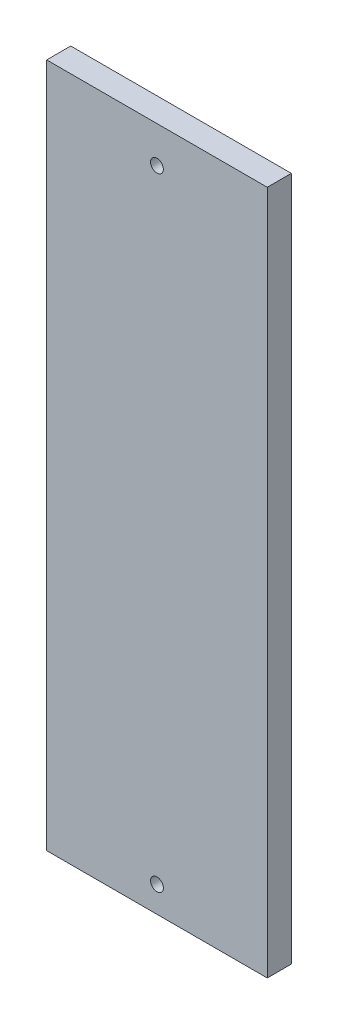
ISO-10303-21;
HEADER;
FILE_DESCRIPTION(('STEP AP214'),'2;1');
FILE_NAME('part.step','',(''),(''),'','','');
FILE_SCHEMA(('AUTOMOTIVE_DESIGN { 1 0 10303 214 1 1 1 1 }'));
ENDSEC;
DATA;
#1=APPLICATION_CONTEXT('core data for automotive mechanical design processes');
#2=APPLICATION_PROTOCOL_DEFINITION('international standard','automotive_design',2000,#1);
#3=PRODUCT_CONTEXT('',#1,'mechanical');
#4=PRODUCT('Part','Part','',(#3));
#5=PRODUCT_RELATED_PRODUCT_CATEGORY('part','',(#4));
#6=PRODUCT_DEFINITION_FORMATION('','',#4);
#7=PRODUCT_DEFINITION_CONTEXT('part definition',#1,'design');
#8=PRODUCT_DEFINITION('design','',#6,#7);
#9=PRODUCT_DEFINITION_SHAPE('','',#8);
#10=(LENGTH_UNIT() NAMED_UNIT(*) SI_UNIT(.MILLI.,.METRE.));
#11=(NAMED_UNIT(*) PLANE_ANGLE_UNIT() SI_UNIT($,.RADIAN.));
#12=(NAMED_UNIT(*) SI_UNIT($,.STERADIAN.) SOLID_ANGLE_UNIT());
#13=UNCERTAINTY_MEASURE_WITH_UNIT(LENGTH_MEASURE(1.E-05),#10,'distance_accuracy_value','');
#14=(GEOMETRIC_REPRESENTATION_CONTEXT(3) GLOBAL_UNCERTAINTY_ASSIGNED_CONTEXT((#13)) GLOBAL_UNIT_ASSIGNED_CONTEXT((#10,
#11,#12)) REPRESENTATION_CONTEXT('',''));
#15=CARTESIAN_POINT('',(0.,0.,0.));
#16=DIRECTION('',(0.,0.,1.));
#17=DIRECTION('',(1.,0.,0.));
#18=AXIS2_PLACEMENT_3D('',#15,#16,#17);
#19=CARTESIAN_POINT('',(0.,0.,6.));
#20=DIRECTION('',(1.,0.,0.));
#21=DIRECTION('',(0.,0.,-1.));
#22=AXIS2_PLACEMENT_3D('',#19,#20,#21);
#23=PLANE('',#22);
#24=DIRECTION('',(0.,-1.,0.));
#25=VECTOR('',#24,1.);
#26=CARTESIAN_POINT('',(0.,0.,0.));
#27=LINE('',#26,#25);
#28=CARTESIAN_POINT('',(0.,170.75,0.));
#29=VERTEX_POINT('',#28);
#30=CARTESIAN_POINT('',(0.,0.,0.));
#31=VERTEX_POINT('',#30);
#32=EDGE_CURVE('E86',#29,#31,#27,.T.);
#33=ORIENTED_EDGE('',*,*,#32,.T.);
#34=DIRECTION('',(0.,0.,-1.));
#35=VECTOR('',#34,1.);
#36=CARTESIAN_POINT('',(0.,0.,6.));
#37=LINE('',#36,#35);
#38=CARTESIAN_POINT('',(0.,0.,6.));
#39=VERTEX_POINT('',#38);
#40=EDGE_CURVE('E11',#39,#31,#37,.T.);
#41=ORIENTED_EDGE('',*,*,#40,.F.);
#42=DIRECTION('',(0.,-1.,0.));
#43=VECTOR('',#42,1.);
#44=CARTESIAN_POINT('',(0.,0.,6.));
#45=LINE('',#44,#43);
#46=CARTESIAN_POINT('',(0.,170.75,6.));
#47=VERTEX_POINT('',#46);
#48=EDGE_CURVE('E80',#47,#39,#45,.T.);
#49=ORIENTED_EDGE('',*,*,#48,.F.);
#50=DIRECTION('',(0.,0.,1.));
#51=VECTOR('',#50,1.);
#52=CARTESIAN_POINT('',(0.,170.75,0.));
#53=LINE('',#52,#51);
#54=EDGE_CURVE('E90',#29,#47,#53,.T.);
#55=ORIENTED_EDGE('',*,*,#54,.F.);
#56=EDGE_LOOP('',(#33,#41,#49,#55));
#57=FACE_BOUND('',#56,.T.);
#58=ADVANCED_FACE('F32',(#57),#23,.F.);
#59=CARTESIAN_POINT('',(0.,0.,6.));
#60=DIRECTION('',(0.,1.,0.));
#61=DIRECTION('',(0.,0.,1.));
#62=AXIS2_PLACEMENT_3D('',#59,#60,#61);
#63=PLANE('',#62);
#64=DIRECTION('',(1.,0.,0.));
#65=VECTOR('',#64,1.);
#66=CARTESIAN_POINT('',(0.,0.,0.));
#67=LINE('',#66,#65);
#68=CARTESIAN_POINT('',(55.,0.,0.));
#69=VERTEX_POINT('',#68);
#70=EDGE_CURVE('E59',#31,#69,#67,.T.);
#71=ORIENTED_EDGE('',*,*,#70,.T.);
#72=DIRECTION('',(0.,0.,-1.));
#73=VECTOR('',#72,1.);
#74=CARTESIAN_POINT('',(55.,0.,6.));
#75=LINE('',#74,#73);
#76=CARTESIAN_POINT('',(55.,0.,6.));
#77=VERTEX_POINT('',#76);
#78=EDGE_CURVE('E40',#77,#69,#75,.T.);
#79=ORIENTED_EDGE('',*,*,#78,.F.);
#80=DIRECTION('',(1.,0.,0.));
#81=VECTOR('',#80,1.);
#82=CARTESIAN_POINT('',(0.,0.,6.));
#83=LINE('',#82,#81);
#84=EDGE_CURVE('E48',#39,#77,#83,.T.);
#85=ORIENTED_EDGE('',*,*,#84,.F.);
#86=ORIENTED_EDGE('',*,*,#40,.T.);
#87=EDGE_LOOP('',(#71,#79,#85,#86));
#88=FACE_BOUND('',#87,.T.);
#89=ADVANCED_FACE('F115',(#88),#63,.F.);
#90=CARTESIAN_POINT('',(55.,0.,6.));
#91=DIRECTION('',(-1.,0.,0.));
#92=DIRECTION('',(0.,0.,1.));
#93=AXIS2_PLACEMENT_3D('',#90,#91,#92);
#94=PLANE('',#93);
#95=DIRECTION('',(0.,1.,0.));
#96=VECTOR('',#95,1.);
#97=CARTESIAN_POINT('',(55.,0.,0.));
#98=LINE('',#97,#96);
#99=CARTESIAN_POINT('',(55.,170.75,0.));
#100=VERTEX_POINT('',#99);
#101=EDGE_CURVE('E75',#69,#100,#98,.T.);
#102=ORIENTED_EDGE('',*,*,#101,.T.);
#103=DIRECTION('',(0.,0.,-1.));
#104=VECTOR('',#103,1.);
#105=CARTESIAN_POINT('',(55.,170.75,0.));
#106=LINE('',#105,#104);
#107=CARTESIAN_POINT('',(55.,170.75,6.));
#108=VERTEX_POINT('',#107);
#109=EDGE_CURVE('E79',#108,#100,#106,.T.);
#110=ORIENTED_EDGE('',*,*,#109,.F.);
#111=DIRECTION('',(0.,1.,0.));
#112=VECTOR('',#111,1.);
#113=CARTESIAN_POINT('',(55.,0.,6.));
#114=LINE('',#113,#112);
#115=EDGE_CURVE('E63',#77,#108,#114,.T.);
#116=ORIENTED_EDGE('',*,*,#115,.F.);
#117=ORIENTED_EDGE('',*,*,#78,.T.);
#118=EDGE_LOOP('',(#102,#110,#116,#117));
#119=FACE_BOUND('',#118,.T.);
#120=ADVANCED_FACE('F77',(#119),#94,.F.);
#121=CARTESIAN_POINT('',(0.,0.,6.));
#122=DIRECTION('',(0.,0.,-1.));
#123=DIRECTION('',(-1.,0.,0.));
#124=AXIS2_PLACEMENT_3D('',#121,#122,#123);
#125=PLANE('',#124);
#126=CARTESIAN_POINT('',(27.5,161.67,6.));
#127=DIRECTION('',(0.,0.,-1.));
#128=DIRECTION('',(-1.,0.,0.));
#129=AXIS2_PLACEMENT_3D('',#126,#127,#128);
#130=CIRCLE('',#129,1.6);
#131=CARTESIAN_POINT('',(25.9,161.67,6.));
#132=VERTEX_POINT('',#131);
#133=EDGE_CURVE('E101',#132,#132,#130,.T.);
#134=ORIENTED_EDGE('',*,*,#133,.T.);
#135=EDGE_LOOP('',(#134));
#136=FACE_BOUND('',#135,.T.);
#137=CARTESIAN_POINT('',(27.5,6.48,6.));
#138=DIRECTION('',(0.,0.,-1.));
#139=DIRECTION('',(-1.,0.,0.));
#140=AXIS2_PLACEMENT_3D('',#137,#138,#139);
#141=CIRCLE('',#140,1.6);
#142=CARTESIAN_POINT('',(25.9,6.48,6.));
#143=VERTEX_POINT('',#142);
#144=EDGE_CURVE('E107',#143,#143,#141,.T.);
#145=ORIENTED_EDGE('',*,*,#144,.T.);
#146=EDGE_LOOP('',(#145));
#147=FACE_BOUND('',#146,.T.);
#148=ORIENTED_EDGE('',*,*,#48,.T.);
#149=ORIENTED_EDGE('',*,*,#84,.T.);
#150=ORIENTED_EDGE('',*,*,#115,.T.);
#151=DIRECTION('',(1.,0.,0.));
#152=VECTOR('',#151,1.);
#153=CARTESIAN_POINT('',(55.,170.75,6.));
#154=LINE('',#153,#152);
#155=EDGE_CURVE('E93',#47,#108,#154,.T.);
#156=ORIENTED_EDGE('',*,*,#155,.F.);
#157=EDGE_LOOP('',(#148,#149,#150,#156));
#158=FACE_BOUND('',#157,.T.);
#159=ADVANCED_FACE('F118',(#136,#147,#158),#125,.F.);
#160=CARTESIAN_POINT('',(0.,0.,0.));
#161=DIRECTION('',(0.,0.,-1.));
#162=DIRECTION('',(-1.,0.,0.));
#163=AXIS2_PLACEMENT_3D('',#160,#161,#162);
#164=PLANE('',#163);
#165=CARTESIAN_POINT('',(27.5,161.67,0.));
#166=DIRECTION('',(0.,0.,-1.));
#167=DIRECTION('',(-1.,0.,0.));
#168=AXIS2_PLACEMENT_3D('',#165,#166,#167);
#169=CIRCLE('',#168,1.59999999999999);
#170=CARTESIAN_POINT('',(25.9,161.67,0.));
#171=VERTEX_POINT('',#170);
#172=EDGE_CURVE('E98',#171,#171,#169,.T.);
#173=ORIENTED_EDGE('',*,*,#172,.F.);
#174=EDGE_LOOP('',(#173));
#175=FACE_BOUND('',#174,.T.);
#176=CARTESIAN_POINT('',(27.5,6.48,0.));
#177=DIRECTION('',(0.,0.,-1.));
#178=DIRECTION('',(-1.,0.,0.));
#179=AXIS2_PLACEMENT_3D('',#176,#177,#178);
#180=CIRCLE('',#179,1.59999999999999);
#181=CARTESIAN_POINT('',(25.9,6.48,0.));
#182=VERTEX_POINT('',#181);
#183=EDGE_CURVE('E104',#182,#182,#180,.T.);
#184=ORIENTED_EDGE('',*,*,#183,.F.);
#185=EDGE_LOOP('',(#184));
#186=FACE_BOUND('',#185,.T.);
#187=ORIENTED_EDGE('',*,*,#32,.F.);
#188=DIRECTION('',(-1.,0.,0.));
#189=VECTOR('',#188,1.);
#190=CARTESIAN_POINT('',(55.,170.75,0.));
#191=LINE('',#190,#189);
#192=EDGE_CURVE('E83',#100,#29,#191,.T.);
#193=ORIENTED_EDGE('',*,*,#192,.F.);
#194=ORIENTED_EDGE('',*,*,#101,.F.);
#195=ORIENTED_EDGE('',*,*,#70,.F.);
#196=EDGE_LOOP('',(#187,#193,#194,#195));
#197=FACE_BOUND('',#196,.T.);
#198=ADVANCED_FACE('F84',(#175,#186,#197),#164,.T.);
#199=CARTESIAN_POINT('',(27.5,6.48,0.));
#200=DIRECTION('',(0.,0.,-1.));
#201=DIRECTION('',(-1.,0.,0.));
#202=AXIS2_PLACEMENT_3D('',#199,#200,#201);
#203=CYLINDRICAL_SURFACE('',#202,1.59999999999999);
#204=ORIENTED_EDGE('',*,*,#144,.F.);
#205=EDGE_LOOP('',(#204));
#206=FACE_BOUND('',#205,.T.);
#207=ORIENTED_EDGE('',*,*,#183,.T.);
#208=EDGE_LOOP('',(#207));
#209=FACE_BOUND('',#208,.T.);
#210=ADVANCED_FACE('F126',(#206,#209),#203,.F.);
#211=CARTESIAN_POINT('',(27.5,161.67,0.));
#212=DIRECTION('',(0.,0.,-1.));
#213=DIRECTION('',(-1.,0.,0.));
#214=AXIS2_PLACEMENT_3D('',#211,#212,#213);
#215=CYLINDRICAL_SURFACE('',#214,1.59999999999999);
#216=ORIENTED_EDGE('',*,*,#133,.F.);
#217=EDGE_LOOP('',(#216));
#218=FACE_BOUND('',#217,.T.);
#219=ORIENTED_EDGE('',*,*,#172,.T.);
#220=EDGE_LOOP('',(#219));
#221=FACE_BOUND('',#220,.T.);
#222=ADVANCED_FACE('F168',(#218,#221),#215,.F.);
#223=CARTESIAN_POINT('',(0.,170.75,0.));
#224=DIRECTION('',(0.,-1.,0.));
#225=DIRECTION('',(0.,0.,-1.));
#226=AXIS2_PLACEMENT_3D('',#223,#224,#225);
#227=PLANE('',#226);
#228=ORIENTED_EDGE('',*,*,#109,.T.);
#229=ORIENTED_EDGE('',*,*,#192,.T.);
#230=ORIENTED_EDGE('',*,*,#54,.T.);
#231=ORIENTED_EDGE('',*,*,#155,.T.);
#232=EDGE_LOOP('',(#228,#229,#230,#231));
#233=FACE_BOUND('',#232,.T.);
#234=ADVANCED_FACE('F92',(#233),#227,.F.);
#235=CLOSED_SHELL('',(#58,#89,#120,#159,#198,#210,#222,#234));
#236=MANIFOLD_SOLID_BREP('B2',#235);
#237=ADVANCED_BREP_SHAPE_REPRESENTATION('',(#18,#236),#14);
#238=SHAPE_DEFINITION_REPRESENTATION(#9,#237);
ENDSEC;
END-ISO-10303-21;
